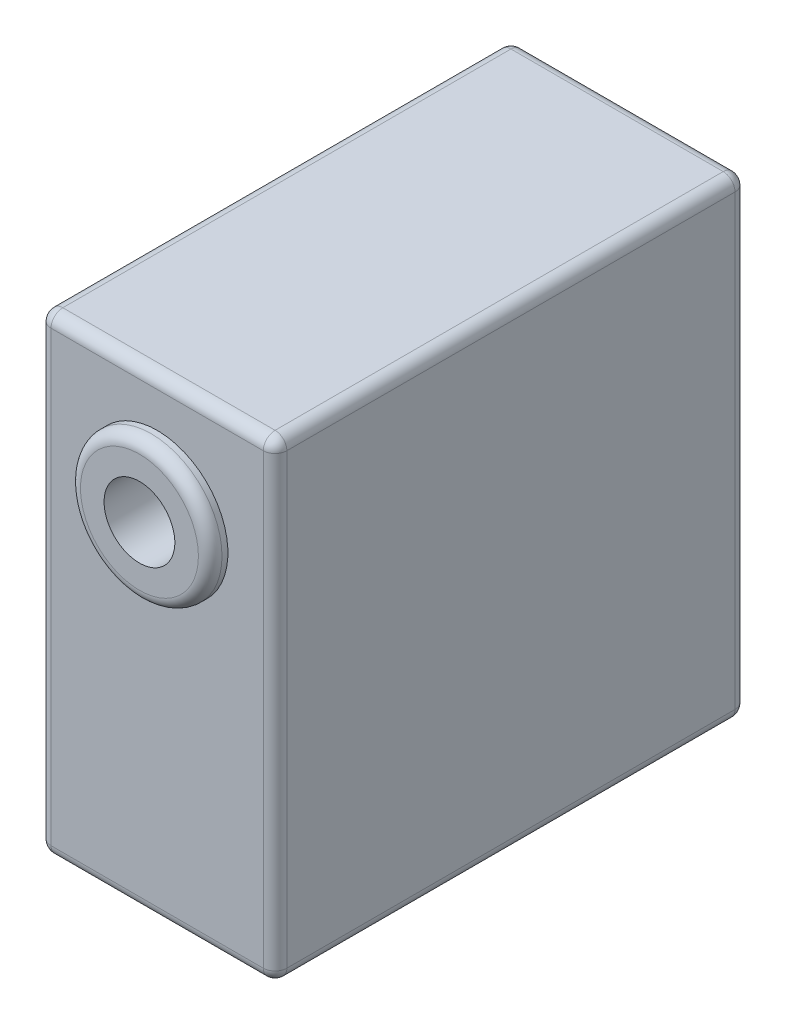
ISO-10303-21;
HEADER;
FILE_DESCRIPTION(('STEP AP214'),'2;1');
FILE_NAME('part.step','',(''),(''),'','','');
FILE_SCHEMA(('AUTOMOTIVE_DESIGN { 1 0 10303 214 1 1 1 1 }'));
ENDSEC;
DATA;
#1=APPLICATION_CONTEXT('core data for automotive mechanical design processes');
#2=APPLICATION_PROTOCOL_DEFINITION('international standard','automotive_design',2000,#1);
#3=PRODUCT_CONTEXT('',#1,'mechanical');
#4=PRODUCT('Part','Part','',(#3));
#5=PRODUCT_RELATED_PRODUCT_CATEGORY('part','',(#4));
#6=PRODUCT_DEFINITION_FORMATION('','',#4);
#7=PRODUCT_DEFINITION_CONTEXT('part definition',#1,'design');
#8=PRODUCT_DEFINITION('design','',#6,#7);
#9=PRODUCT_DEFINITION_SHAPE('','',#8);
#10=(LENGTH_UNIT() NAMED_UNIT(*) SI_UNIT(.MILLI.,.METRE.));
#11=(NAMED_UNIT(*) PLANE_ANGLE_UNIT() SI_UNIT($,.RADIAN.));
#12=(NAMED_UNIT(*) SI_UNIT($,.STERADIAN.) SOLID_ANGLE_UNIT());
#13=UNCERTAINTY_MEASURE_WITH_UNIT(LENGTH_MEASURE(1.E-05),#10,'distance_accuracy_value','');
#14=(GEOMETRIC_REPRESENTATION_CONTEXT(3) GLOBAL_UNCERTAINTY_ASSIGNED_CONTEXT((#13)) GLOBAL_UNIT_ASSIGNED_CONTEXT((#10,
#11,#12)) REPRESENTATION_CONTEXT('',''));
#15=CARTESIAN_POINT('',(0.,0.,0.));
#16=DIRECTION('',(0.,0.,1.));
#17=DIRECTION('',(1.,0.,0.));
#18=AXIS2_PLACEMENT_3D('',#15,#16,#17);
#19=CARTESIAN_POINT('',(20.,-27.1272727272727,13.3818181818182));
#20=DIRECTION('',(0.,0.,-1.));
#21=DIRECTION('',(-1.,0.,0.));
#22=AXIS2_PLACEMENT_3D('',#19,#20,#21);
#23=PLANE('',#22);
#24=CARTESIAN_POINT('',(10.,2.87272727272728,13.3818181818182));
#25=DIRECTION('',(0.,0.,-1.));
#26=DIRECTION('',(-1.,0.,0.));
#27=AXIS2_PLACEMENT_3D('',#24,#25,#26);
#28=CIRCLE('',#27,6.);
#29=CARTESIAN_POINT('',(4.,2.87272727272728,13.3818181818182));
#30=VERTEX_POINT('',#29);
#31=EDGE_CURVE('E215',#30,#30,#28,.F.);
#32=ORIENTED_EDGE('',*,*,#31,.F.);
#33=EDGE_LOOP('',(#32));
#34=FACE_BOUND('',#33,.T.);
#35=DIRECTION('',(0.,-1.,0.));
#36=VECTOR('',#35,1.);
#37=CARTESIAN_POINT('',(1.,-27.1272727272727,13.3818181818182));
#38=LINE('',#37,#36);
#39=CARTESIAN_POINT('',(1.,11.8727272727273,13.3818181818182));
#40=VERTEX_POINT('',#39);
#41=CARTESIAN_POINT('',(1.,-26.1272727272727,13.3818181818182));
#42=VERTEX_POINT('',#41);
#43=EDGE_CURVE('E194',#40,#42,#38,.T.);
#44=ORIENTED_EDGE('',*,*,#43,.T.);
#45=DIRECTION('',(-1.,0.,0.));
#46=VECTOR('',#45,1.);
#47=CARTESIAN_POINT('',(20.,-26.1272727272727,13.3818181818182));
#48=LINE('',#47,#46);
#49=CARTESIAN_POINT('',(19.,-26.1272727272727,13.3818181818182));
#50=VERTEX_POINT('',#49);
#51=EDGE_CURVE('E198',#42,#50,#48,.F.);
#52=ORIENTED_EDGE('',*,*,#51,.T.);
#53=DIRECTION('',(0.,-1.,0.));
#54=VECTOR('',#53,1.);
#55=CARTESIAN_POINT('',(19.,-27.1272727272727,13.3818181818182));
#56=LINE('',#55,#54);
#57=CARTESIAN_POINT('',(19.,11.8727272727273,13.3818181818182));
#58=VERTEX_POINT('',#57);
#59=EDGE_CURVE('E196',#50,#58,#56,.F.);
#60=ORIENTED_EDGE('',*,*,#59,.T.);
#61=DIRECTION('',(-1.,0.,0.));
#62=VECTOR('',#61,1.);
#63=CARTESIAN_POINT('',(20.,11.8727272727273,13.3818181818182));
#64=LINE('',#63,#62);
#65=EDGE_CURVE('E192',#58,#40,#64,.T.);
#66=ORIENTED_EDGE('',*,*,#65,.T.);
#67=EDGE_LOOP('',(#44,#52,#60,#66));
#68=FACE_BOUND('',#67,.T.);
#69=ADVANCED_FACE('F44',(#34,#68),#23,.F.);
#70=CARTESIAN_POINT('',(20.,-27.1272727272727,-26.6181818181818));
#71=DIRECTION('',(0.,1.,0.));
#72=DIRECTION('',(0.,0.,1.));
#73=AXIS2_PLACEMENT_3D('',#70,#71,#72);
#74=PLANE('',#73);
#75=DIRECTION('',(0.,0.,-1.));
#76=VECTOR('',#75,1.);
#77=CARTESIAN_POINT('',(1.,-27.1272727272727,-26.6181818181818));
#78=LINE('',#77,#76);
#79=CARTESIAN_POINT('',(1.,-27.1272727272727,12.3818181818182));
#80=VERTEX_POINT('',#79);
#81=CARTESIAN_POINT('',(1.,-27.1272727272727,-25.6181818181818));
#82=VERTEX_POINT('',#81);
#83=EDGE_CURVE('E187',#80,#82,#78,.T.);
#84=ORIENTED_EDGE('',*,*,#83,.T.);
#85=DIRECTION('',(-1.,0.,0.));
#86=VECTOR('',#85,1.);
#87=CARTESIAN_POINT('',(20.,-27.1272727272727,-25.6181818181818));
#88=LINE('',#87,#86);
#89=CARTESIAN_POINT('',(19.,-27.1272727272727,-25.6181818181818));
#90=VERTEX_POINT('',#89);
#91=EDGE_CURVE('E189',#82,#90,#88,.F.);
#92=ORIENTED_EDGE('',*,*,#91,.T.);
#93=DIRECTION('',(0.,0.,-1.));
#94=VECTOR('',#93,1.);
#95=CARTESIAN_POINT('',(19.,-27.1272727272727,-26.6181818181818));
#96=LINE('',#95,#94);
#97=CARTESIAN_POINT('',(19.,-27.1272727272727,12.3818181818182));
#98=VERTEX_POINT('',#97);
#99=EDGE_CURVE('E183',#90,#98,#96,.F.);
#100=ORIENTED_EDGE('',*,*,#99,.T.);
#101=DIRECTION('',(-1.,0.,0.));
#102=VECTOR('',#101,1.);
#103=CARTESIAN_POINT('',(20.,-27.1272727272727,12.3818181818182));
#104=LINE('',#103,#102);
#105=EDGE_CURVE('E185',#98,#80,#104,.T.);
#106=ORIENTED_EDGE('',*,*,#105,.T.);
#107=EDGE_LOOP('',(#84,#92,#100,#106));
#108=FACE_BOUND('',#107,.T.);
#109=ADVANCED_FACE('F285',(#108),#74,.F.);
#110=CARTESIAN_POINT('',(20.,12.8727272727273,-26.6181818181818));
#111=DIRECTION('',(0.,0.,1.));
#112=DIRECTION('',(1.,0.,0.));
#113=AXIS2_PLACEMENT_3D('',#110,#111,#112);
#114=PLANE('',#113);
#115=CARTESIAN_POINT('',(10.,2.87272727272728,-26.6181818181818));
#116=DIRECTION('',(0.,0.,1.));
#117=DIRECTION('',(1.,0.,0.));
#118=AXIS2_PLACEMENT_3D('',#115,#116,#117);
#119=CIRCLE('',#118,6.);
#120=CARTESIAN_POINT('',(16.,2.87272727272728,-26.6181818181818));
#121=VERTEX_POINT('',#120);
#122=EDGE_CURVE('E52',#121,#121,#119,.F.);
#123=ORIENTED_EDGE('',*,*,#122,.F.);
#124=EDGE_LOOP('',(#123));
#125=FACE_BOUND('',#124,.T.);
#126=DIRECTION('',(-1.,0.,0.));
#127=VECTOR('',#126,1.);
#128=CARTESIAN_POINT('',(20.,-26.1272727272727,-26.6181818181818));
#129=LINE('',#128,#127);
#130=CARTESIAN_POINT('',(19.,-26.1272727272727,-26.6181818181818));
#131=VERTEX_POINT('',#130);
#132=CARTESIAN_POINT('',(1.,-26.1272727272727,-26.6181818181818));
#133=VERTEX_POINT('',#132);
#134=EDGE_CURVE('E170',#131,#133,#129,.T.);
#135=ORIENTED_EDGE('',*,*,#134,.T.);
#136=DIRECTION('',(0.,1.,0.));
#137=VECTOR('',#136,1.);
#138=CARTESIAN_POINT('',(1.,12.8727272727273,-26.6181818181818));
#139=LINE('',#138,#137);
#140=CARTESIAN_POINT('',(1.,11.8727272727273,-26.6181818181818));
#141=VERTEX_POINT('',#140);
#142=EDGE_CURVE('E140',#133,#141,#139,.T.);
#143=ORIENTED_EDGE('',*,*,#142,.T.);
#144=DIRECTION('',(-1.,0.,0.));
#145=VECTOR('',#144,1.);
#146=CARTESIAN_POINT('',(20.,11.8727272727273,-26.6181818181818));
#147=LINE('',#146,#145);
#148=CARTESIAN_POINT('',(19.,11.8727272727273,-26.6181818181818));
#149=VERTEX_POINT('',#148);
#150=EDGE_CURVE('E159',#141,#149,#147,.F.);
#151=ORIENTED_EDGE('',*,*,#150,.T.);
#152=DIRECTION('',(0.,1.,0.));
#153=VECTOR('',#152,1.);
#154=CARTESIAN_POINT('',(19.,12.8727272727273,-26.6181818181818));
#155=LINE('',#154,#153);
#156=EDGE_CURVE('E165',#149,#131,#155,.F.);
#157=ORIENTED_EDGE('',*,*,#156,.T.);
#158=EDGE_LOOP('',(#135,#143,#151,#157));
#159=FACE_BOUND('',#158,.T.);
#160=ADVANCED_FACE('F168',(#125,#159),#114,.F.);
#161=CARTESIAN_POINT('',(20.,12.8727272727273,13.3818181818182));
#162=DIRECTION('',(0.,-1.,0.));
#163=DIRECTION('',(0.,0.,-1.));
#164=AXIS2_PLACEMENT_3D('',#161,#162,#163);
#165=PLANE('',#164);
#166=DIRECTION('',(0.,0.,1.));
#167=VECTOR('',#166,1.);
#168=CARTESIAN_POINT('',(1.,12.8727272727273,13.3818181818182));
#169=LINE('',#168,#167);
#170=CARTESIAN_POINT('',(1.,12.8727272727273,-25.6181818181818));
#171=VERTEX_POINT('',#170);
#172=CARTESIAN_POINT('',(1.,12.8727272727273,12.3818181818182));
#173=VERTEX_POINT('',#172);
#174=EDGE_CURVE('E59',#171,#173,#169,.T.);
#175=ORIENTED_EDGE('',*,*,#174,.T.);
#176=DIRECTION('',(-1.,0.,0.));
#177=VECTOR('',#176,1.);
#178=CARTESIAN_POINT('',(20.,12.8727272727273,12.3818181818182));
#179=LINE('',#178,#177);
#180=CARTESIAN_POINT('',(19.,12.8727272727273,12.3818181818182));
#181=VERTEX_POINT('',#180);
#182=EDGE_CURVE('E214',#173,#181,#179,.F.);
#183=ORIENTED_EDGE('',*,*,#182,.T.);
#184=DIRECTION('',(0.,0.,1.));
#185=VECTOR('',#184,1.);
#186=CARTESIAN_POINT('',(19.,12.8727272727273,13.3818181818182));
#187=LINE('',#186,#185);
#188=CARTESIAN_POINT('',(19.,12.8727272727273,-25.6181818181818));
#189=VERTEX_POINT('',#188);
#190=EDGE_CURVE('E67',#181,#189,#187,.F.);
#191=ORIENTED_EDGE('',*,*,#190,.T.);
#192=DIRECTION('',(-1.,0.,0.));
#193=VECTOR('',#192,1.);
#194=CARTESIAN_POINT('',(20.,12.8727272727273,-25.6181818181818));
#195=LINE('',#194,#193);
#196=EDGE_CURVE('E210',#189,#171,#195,.T.);
#197=ORIENTED_EDGE('',*,*,#196,.T.);
#198=EDGE_LOOP('',(#175,#183,#191,#197));
#199=FACE_BOUND('',#198,.T.);
#200=ADVANCED_FACE('F284',(#199),#165,.F.);
#201=CARTESIAN_POINT('',(20.,0.,0.));
#202=DIRECTION('',(-1.,0.,0.));
#203=DIRECTION('',(0.,0.,1.));
#204=AXIS2_PLACEMENT_3D('',#201,#202,#203);
#205=PLANE('',#204);
#206=DIRECTION('',(0.,-1.,0.));
#207=VECTOR('',#206,1.);
#208=CARTESIAN_POINT('',(20.,0.,12.3818181818182));
#209=LINE('',#208,#207);
#210=CARTESIAN_POINT('',(20.,11.8727272727273,12.3818181818182));
#211=VERTEX_POINT('',#210);
#212=CARTESIAN_POINT('',(20.,-26.1272727272727,12.3818181818182));
#213=VERTEX_POINT('',#212);
#214=EDGE_CURVE('E203',#211,#213,#209,.T.);
#215=ORIENTED_EDGE('',*,*,#214,.T.);
#216=DIRECTION('',(0.,0.,-1.));
#217=VECTOR('',#216,1.);
#218=CARTESIAN_POINT('',(20.,-26.1272727272727,0.));
#219=LINE('',#218,#217);
#220=CARTESIAN_POINT('',(20.,-26.1272727272727,-25.6181818181818));
#221=VERTEX_POINT('',#220);
#222=EDGE_CURVE('E207',#213,#221,#219,.T.);
#223=ORIENTED_EDGE('',*,*,#222,.T.);
#224=DIRECTION('',(0.,1.,0.));
#225=VECTOR('',#224,1.);
#226=CARTESIAN_POINT('',(20.,0.,-25.6181818181818));
#227=LINE('',#226,#225);
#228=CARTESIAN_POINT('',(20.,11.8727272727273,-25.6181818181818));
#229=VERTEX_POINT('',#228);
#230=EDGE_CURVE('E205',#221,#229,#227,.T.);
#231=ORIENTED_EDGE('',*,*,#230,.T.);
#232=DIRECTION('',(0.,0.,1.));
#233=VECTOR('',#232,1.);
#234=CARTESIAN_POINT('',(20.,11.8727272727273,0.));
#235=LINE('',#234,#233);
#236=EDGE_CURVE('E201',#229,#211,#235,.T.);
#237=ORIENTED_EDGE('',*,*,#236,.T.);
#238=EDGE_LOOP('',(#215,#223,#231,#237));
#239=FACE_BOUND('',#238,.T.);
#240=ADVANCED_FACE('F291',(#239),#205,.F.);
#241=CARTESIAN_POINT('',(0.,0.,0.));
#242=DIRECTION('',(-1.,0.,0.));
#243=DIRECTION('',(0.,0.,1.));
#244=AXIS2_PLACEMENT_3D('',#241,#242,#243);
#245=PLANE('',#244);
#246=DIRECTION('',(0.,0.,1.));
#247=VECTOR('',#246,1.);
#248=CARTESIAN_POINT('',(0.,11.8727272727273,-26.6181818181818));
#249=LINE('',#248,#247);
#250=CARTESIAN_POINT('',(0.,11.8727272727273,12.3818181818182));
#251=VERTEX_POINT('',#250);
#252=CARTESIAN_POINT('',(0.,11.8727272727273,-25.6181818181818));
#253=VERTEX_POINT('',#252);
#254=EDGE_CURVE('E172',#251,#253,#249,.F.);
#255=ORIENTED_EDGE('',*,*,#254,.T.);
#256=DIRECTION('',(0.,1.,0.));
#257=VECTOR('',#256,1.);
#258=CARTESIAN_POINT('',(0.,-27.1272727272727,-25.6181818181818));
#259=LINE('',#258,#257);
#260=CARTESIAN_POINT('',(0.,-26.1272727272727,-25.6181818181818));
#261=VERTEX_POINT('',#260);
#262=EDGE_CURVE('E142',#253,#261,#259,.F.);
#263=ORIENTED_EDGE('',*,*,#262,.T.);
#264=DIRECTION('',(0.,0.,-1.));
#265=VECTOR('',#264,1.);
#266=CARTESIAN_POINT('',(0.,-26.1272727272727,13.3818181818182));
#267=LINE('',#266,#265);
#268=CARTESIAN_POINT('',(0.,-26.1272727272727,12.3818181818182));
#269=VERTEX_POINT('',#268);
#270=EDGE_CURVE('E180',#261,#269,#267,.F.);
#271=ORIENTED_EDGE('',*,*,#270,.T.);
#272=DIRECTION('',(0.,-1.,0.));
#273=VECTOR('',#272,1.);
#274=CARTESIAN_POINT('',(0.,12.8727272727273,12.3818181818182));
#275=LINE('',#274,#273);
#276=EDGE_CURVE('E174',#269,#251,#275,.F.);
#277=ORIENTED_EDGE('',*,*,#276,.T.);
#278=EDGE_LOOP('',(#255,#263,#271,#277));
#279=FACE_BOUND('',#278,.T.);
#280=ADVANCED_FACE('F375',(#279),#245,.T.);
#281=CARTESIAN_POINT('',(19.,0.,12.3818181818182));
#282=DIRECTION('',(0.,-1.,0.));
#283=DIRECTION('',(0.,0.,-1.));
#284=AXIS2_PLACEMENT_3D('',#281,#282,#283);
#285=CYLINDRICAL_SURFACE('',#284,1.);
#286=CARTESIAN_POINT('',(19.,-26.1272727272727,12.3818181818182));
#287=DIRECTION('',(0.,-1.,0.));
#288=DIRECTION('',(0.,0.,-1.));
#289=AXIS2_PLACEMENT_3D('',#286,#287,#288);
#290=CIRCLE('',#289,1.);
#291=EDGE_CURVE('E166',#213,#50,#290,.T.);
#292=ORIENTED_EDGE('',*,*,#291,.F.);
#293=ORIENTED_EDGE('',*,*,#214,.F.);
#294=CARTESIAN_POINT('',(19.,11.8727272727273,12.3818181818182));
#295=DIRECTION('',(0.,1.,0.));
#296=DIRECTION('',(0.,0.,1.));
#297=AXIS2_PLACEMENT_3D('',#294,#295,#296);
#298=CIRCLE('',#297,1.);
#299=EDGE_CURVE('E266',#58,#211,#298,.T.);
#300=ORIENTED_EDGE('',*,*,#299,.F.);
#301=ORIENTED_EDGE('',*,*,#59,.F.);
#302=EDGE_LOOP('',(#292,#293,#300,#301));
#303=FACE_BOUND('',#302,.T.);
#304=ADVANCED_FACE('F372',(#303),#285,.T.);
#305=CARTESIAN_POINT('',(19.,-26.1272727272727,12.3818181818182));
#306=DIRECTION('',(0.,0.,1.));
#307=DIRECTION('',(1.,0.,0.));
#308=AXIS2_PLACEMENT_3D('',#305,#306,#307);
#309=SPHERICAL_SURFACE('',#308,1.);
#310=CARTESIAN_POINT('',(19.,-26.1272727272727,12.3818181818182));
#311=DIRECTION('',(0.,0.,1.));
#312=DIRECTION('',(1.,0.,0.));
#313=AXIS2_PLACEMENT_3D('',#310,#311,#312);
#314=CIRCLE('',#313,1.);
#315=EDGE_CURVE('E261',#213,#98,#314,.F.);
#316=ORIENTED_EDGE('',*,*,#315,.F.);
#317=ORIENTED_EDGE('',*,*,#291,.T.);
#318=CARTESIAN_POINT('',(19.,-26.1272727272727,12.3818181818182));
#319=DIRECTION('',(1.,0.,0.));
#320=DIRECTION('',(0.,0.,-1.));
#321=AXIS2_PLACEMENT_3D('',#318,#319,#320);
#322=CIRCLE('',#321,1.);
#323=EDGE_CURVE('E264',#98,#50,#322,.F.);
#324=ORIENTED_EDGE('',*,*,#323,.F.);
#325=EDGE_LOOP('',(#316,#317,#324));
#326=FACE_BOUND('',#325,.T.);
#327=ADVANCED_FACE('F368',(#326),#309,.T.);
#328=CARTESIAN_POINT('',(19.,11.8727272727273,12.3818181818182));
#329=DIRECTION('',(0.,0.,1.));
#330=DIRECTION('',(1.,0.,0.));
#331=AXIS2_PLACEMENT_3D('',#328,#329,#330);
#332=SPHERICAL_SURFACE('',#331,1.);
#333=CARTESIAN_POINT('',(19.,11.8727272727273,12.3818181818182));
#334=DIRECTION('',(1.,0.,0.));
#335=DIRECTION('',(0.,0.,-1.));
#336=AXIS2_PLACEMENT_3D('',#333,#334,#335);
#337=CIRCLE('',#336,1.);
#338=EDGE_CURVE('E256',#58,#181,#337,.F.);
#339=ORIENTED_EDGE('',*,*,#338,.F.);
#340=ORIENTED_EDGE('',*,*,#299,.T.);
#341=CARTESIAN_POINT('',(19.,11.8727272727273,12.3818181818182));
#342=DIRECTION('',(0.,0.,1.));
#343=DIRECTION('',(1.,0.,0.));
#344=AXIS2_PLACEMENT_3D('',#341,#342,#343);
#345=CIRCLE('',#344,1.);
#346=EDGE_CURVE('E259',#181,#211,#345,.F.);
#347=ORIENTED_EDGE('',*,*,#346,.F.);
#348=EDGE_LOOP('',(#339,#340,#347));
#349=FACE_BOUND('',#348,.T.);
#350=ADVANCED_FACE('F364',(#349),#332,.T.);
#351=CARTESIAN_POINT('',(20.,-26.1272727272727,12.3818181818182));
#352=DIRECTION('',(-1.,0.,0.));
#353=DIRECTION('',(0.,0.,1.));
#354=AXIS2_PLACEMENT_3D('',#351,#352,#353);
#355=CYLINDRICAL_SURFACE('',#354,1.);
#356=ORIENTED_EDGE('',*,*,#323,.T.);
#357=ORIENTED_EDGE('',*,*,#51,.F.);
#358=CARTESIAN_POINT('',(1.,-26.1272727272727,12.3818181818182));
#359=DIRECTION('',(-1.,0.,0.));
#360=DIRECTION('',(0.,0.,1.));
#361=AXIS2_PLACEMENT_3D('',#358,#359,#360);
#362=CIRCLE('',#361,1.);
#363=EDGE_CURVE('E250',#80,#42,#362,.T.);
#364=ORIENTED_EDGE('',*,*,#363,.F.);
#365=ORIENTED_EDGE('',*,*,#105,.F.);
#366=EDGE_LOOP('',(#356,#357,#364,#365));
#367=FACE_BOUND('',#366,.T.);
#368=ADVANCED_FACE('F360',(#367),#355,.T.);
#369=CARTESIAN_POINT('',(19.,-26.1272727272727,0.));
#370=DIRECTION('',(0.,0.,-1.));
#371=DIRECTION('',(0.,1.,0.));
#372=AXIS2_PLACEMENT_3D('',#369,#370,#371);
#373=CYLINDRICAL_SURFACE('',#372,1.);
#374=ORIENTED_EDGE('',*,*,#315,.T.);
#375=ORIENTED_EDGE('',*,*,#99,.F.);
#376=CARTESIAN_POINT('',(19.,-26.1272727272727,-25.6181818181818));
#377=DIRECTION('',(0.,0.,-1.));
#378=DIRECTION('',(-1.,0.,0.));
#379=AXIS2_PLACEMENT_3D('',#376,#377,#378);
#380=CIRCLE('',#379,1.);
#381=EDGE_CURVE('E247',#221,#90,#380,.T.);
#382=ORIENTED_EDGE('',*,*,#381,.F.);
#383=ORIENTED_EDGE('',*,*,#222,.F.);
#384=EDGE_LOOP('',(#374,#375,#382,#383));
#385=FACE_BOUND('',#384,.T.);
#386=ADVANCED_FACE('F356',(#385),#373,.T.);
#387=CARTESIAN_POINT('',(19.,0.,-25.6181818181818));
#388=DIRECTION('',(0.,1.,0.));
#389=DIRECTION('',(0.,0.,1.));
#390=AXIS2_PLACEMENT_3D('',#387,#388,#389);
#391=CYLINDRICAL_SURFACE('',#390,1.);
#392=CARTESIAN_POINT('',(19.,11.8727272727273,-25.6181818181818));
#393=DIRECTION('',(0.,1.,0.));
#394=DIRECTION('',(0.,0.,1.));
#395=AXIS2_PLACEMENT_3D('',#392,#393,#394);
#396=CIRCLE('',#395,1.);
#397=EDGE_CURVE('E242',#229,#149,#396,.T.);
#398=ORIENTED_EDGE('',*,*,#397,.F.);
#399=ORIENTED_EDGE('',*,*,#230,.F.);
#400=CARTESIAN_POINT('',(19.,-26.1272727272727,-25.6181818181818));
#401=DIRECTION('',(0.,-1.,0.));
#402=DIRECTION('',(1.,0.,0.));
#403=AXIS2_PLACEMENT_3D('',#400,#401,#402);
#404=CIRCLE('',#403,1.);
#405=EDGE_CURVE('E245',#131,#221,#404,.T.);
#406=ORIENTED_EDGE('',*,*,#405,.F.);
#407=ORIENTED_EDGE('',*,*,#156,.F.);
#408=EDGE_LOOP('',(#398,#399,#406,#407));
#409=FACE_BOUND('',#408,.T.);
#410=ADVANCED_FACE('F353',(#409),#391,.T.);
#411=CARTESIAN_POINT('',(19.,11.8727272727273,0.));
#412=DIRECTION('',(0.,0.,1.));
#413=DIRECTION('',(1.,0.,0.));
#414=AXIS2_PLACEMENT_3D('',#411,#412,#413);
#415=CYLINDRICAL_SURFACE('',#414,1.);
#416=ORIENTED_EDGE('',*,*,#346,.T.);
#417=ORIENTED_EDGE('',*,*,#236,.F.);
#418=CARTESIAN_POINT('',(19.,11.8727272727273,-25.6181818181818));
#419=DIRECTION('',(0.,0.,-1.));
#420=DIRECTION('',(-1.,0.,0.));
#421=AXIS2_PLACEMENT_3D('',#418,#419,#420);
#422=CIRCLE('',#421,1.);
#423=EDGE_CURVE('E239',#189,#229,#422,.T.);
#424=ORIENTED_EDGE('',*,*,#423,.F.);
#425=ORIENTED_EDGE('',*,*,#190,.F.);
#426=EDGE_LOOP('',(#416,#417,#424,#425));
#427=FACE_BOUND('',#426,.T.);
#428=ADVANCED_FACE('F349',(#427),#415,.T.);
#429=CARTESIAN_POINT('',(20.,11.8727272727273,12.3818181818182));
#430=DIRECTION('',(-1.,0.,0.));
#431=DIRECTION('',(0.,0.,1.));
#432=AXIS2_PLACEMENT_3D('',#429,#430,#431);
#433=CYLINDRICAL_SURFACE('',#432,1.);
#434=ORIENTED_EDGE('',*,*,#338,.T.);
#435=ORIENTED_EDGE('',*,*,#182,.F.);
#436=CARTESIAN_POINT('',(1.,11.8727272727273,12.3818181818182));
#437=DIRECTION('',(-1.,0.,0.));
#438=DIRECTION('',(0.,0.,1.));
#439=AXIS2_PLACEMENT_3D('',#436,#437,#438);
#440=CIRCLE('',#439,1.);
#441=EDGE_CURVE('E236',#40,#173,#440,.T.);
#442=ORIENTED_EDGE('',*,*,#441,.F.);
#443=ORIENTED_EDGE('',*,*,#65,.F.);
#444=EDGE_LOOP('',(#434,#435,#442,#443));
#445=FACE_BOUND('',#444,.T.);
#446=ADVANCED_FACE('F345',(#445),#433,.T.);
#447=CARTESIAN_POINT('',(1.,-27.1272727272727,12.3818181818182));
#448=DIRECTION('',(0.,1.,0.));
#449=DIRECTION('',(0.,0.,1.));
#450=AXIS2_PLACEMENT_3D('',#447,#448,#449);
#451=CYLINDRICAL_SURFACE('',#450,1.);
#452=CARTESIAN_POINT('',(1.,-26.1272727272727,12.3818181818182));
#453=DIRECTION('',(0.,-1.,0.));
#454=DIRECTION('',(0.,0.,-1.));
#455=AXIS2_PLACEMENT_3D('',#452,#453,#454);
#456=CIRCLE('',#455,1.);
#457=EDGE_CURVE('E253',#42,#269,#456,.T.);
#458=ORIENTED_EDGE('',*,*,#457,.F.);
#459=ORIENTED_EDGE('',*,*,#43,.F.);
#460=CARTESIAN_POINT('',(1.,11.8727272727273,12.3818181818182));
#461=DIRECTION('',(0.,1.,0.));
#462=DIRECTION('',(0.,0.,1.));
#463=AXIS2_PLACEMENT_3D('',#460,#461,#462);
#464=CIRCLE('',#463,1.);
#465=EDGE_CURVE('E233',#251,#40,#464,.T.);
#466=ORIENTED_EDGE('',*,*,#465,.F.);
#467=ORIENTED_EDGE('',*,*,#276,.F.);
#468=EDGE_LOOP('',(#458,#459,#466,#467));
#469=FACE_BOUND('',#468,.T.);
#470=ADVANCED_FACE('F341',(#469),#451,.T.);
#471=CARTESIAN_POINT('',(1.,-26.1272727272727,12.3818181818182));
#472=DIRECTION('',(0.,0.,1.));
#473=DIRECTION('',(1.,0.,0.));
#474=AXIS2_PLACEMENT_3D('',#471,#472,#473);
#475=SPHERICAL_SURFACE('',#474,1.);
#476=ORIENTED_EDGE('',*,*,#363,.T.);
#477=ORIENTED_EDGE('',*,*,#457,.T.);
#478=CARTESIAN_POINT('',(1.,-26.1272727272727,12.3818181818182));
#479=DIRECTION('',(0.,0.,1.));
#480=DIRECTION('',(0.,-1.,0.));
#481=AXIS2_PLACEMENT_3D('',#478,#479,#480);
#482=CIRCLE('',#481,1.);
#483=EDGE_CURVE('E230',#80,#269,#482,.F.);
#484=ORIENTED_EDGE('',*,*,#483,.F.);
#485=EDGE_LOOP('',(#476,#477,#484));
#486=FACE_BOUND('',#485,.T.);
#487=ADVANCED_FACE('F337',(#486),#475,.T.);
#488=CARTESIAN_POINT('',(19.,-26.1272727272727,-25.6181818181818));
#489=DIRECTION('',(0.,0.,1.));
#490=DIRECTION('',(1.,0.,0.));
#491=AXIS2_PLACEMENT_3D('',#488,#489,#490);
#492=SPHERICAL_SURFACE('',#491,1.);
#493=ORIENTED_EDGE('',*,*,#405,.T.);
#494=ORIENTED_EDGE('',*,*,#381,.T.);
#495=CARTESIAN_POINT('',(19.,-26.1272727272727,-25.6181818181818));
#496=DIRECTION('',(1.,0.,0.));
#497=DIRECTION('',(0.,0.,-1.));
#498=AXIS2_PLACEMENT_3D('',#495,#496,#497);
#499=CIRCLE('',#498,1.);
#500=EDGE_CURVE('E228',#131,#90,#499,.F.);
#501=ORIENTED_EDGE('',*,*,#500,.F.);
#502=EDGE_LOOP('',(#493,#494,#501));
#503=FACE_BOUND('',#502,.T.);
#504=ADVANCED_FACE('F333',(#503),#492,.T.);
#505=CARTESIAN_POINT('',(19.,11.8727272727273,-25.6181818181818));
#506=DIRECTION('',(0.,0.,1.));
#507=DIRECTION('',(1.,0.,0.));
#508=AXIS2_PLACEMENT_3D('',#505,#506,#507);
#509=SPHERICAL_SURFACE('',#508,1.);
#510=ORIENTED_EDGE('',*,*,#423,.T.);
#511=ORIENTED_EDGE('',*,*,#397,.T.);
#512=CARTESIAN_POINT('',(19.,11.8727272727273,-25.6181818181818));
#513=DIRECTION('',(1.,0.,0.));
#514=DIRECTION('',(0.,0.,-1.));
#515=AXIS2_PLACEMENT_3D('',#512,#513,#514);
#516=CIRCLE('',#515,1.);
#517=EDGE_CURVE('E162',#189,#149,#516,.F.);
#518=ORIENTED_EDGE('',*,*,#517,.F.);
#519=EDGE_LOOP('',(#510,#511,#518));
#520=FACE_BOUND('',#519,.T.);
#521=ADVANCED_FACE('F329',(#520),#509,.T.);
#522=CARTESIAN_POINT('',(1.,11.8727272727273,12.3818181818182));
#523=DIRECTION('',(0.,0.,1.));
#524=DIRECTION('',(1.,0.,0.));
#525=AXIS2_PLACEMENT_3D('',#522,#523,#524);
#526=SPHERICAL_SURFACE('',#525,1.);
#527=ORIENTED_EDGE('',*,*,#465,.T.);
#528=ORIENTED_EDGE('',*,*,#441,.T.);
#529=CARTESIAN_POINT('',(1.,11.8727272727273,12.3818181818182));
#530=DIRECTION('',(0.,0.,1.));
#531=DIRECTION('',(1.,0.,0.));
#532=AXIS2_PLACEMENT_3D('',#529,#530,#531);
#533=CIRCLE('',#532,1.);
#534=EDGE_CURVE('E224',#251,#173,#533,.F.);
#535=ORIENTED_EDGE('',*,*,#534,.F.);
#536=EDGE_LOOP('',(#527,#528,#535));
#537=FACE_BOUND('',#536,.T.);
#538=ADVANCED_FACE('F325',(#537),#526,.T.);
#539=CARTESIAN_POINT('',(1.,-26.1272727272727,-26.6181818181818));
#540=DIRECTION('',(0.,0.,1.));
#541=DIRECTION('',(0.,-1.,0.));
#542=AXIS2_PLACEMENT_3D('',#539,#540,#541);
#543=CYLINDRICAL_SURFACE('',#542,1.);
#544=ORIENTED_EDGE('',*,*,#483,.T.);
#545=ORIENTED_EDGE('',*,*,#270,.F.);
#546=CARTESIAN_POINT('',(1.,-26.1272727272727,-25.6181818181818));
#547=DIRECTION('',(0.,0.,-1.));
#548=DIRECTION('',(-1.,0.,0.));
#549=AXIS2_PLACEMENT_3D('',#546,#547,#548);
#550=CIRCLE('',#549,1.);
#551=EDGE_CURVE('E221',#82,#261,#550,.T.);
#552=ORIENTED_EDGE('',*,*,#551,.F.);
#553=ORIENTED_EDGE('',*,*,#83,.F.);
#554=EDGE_LOOP('',(#544,#545,#552,#553));
#555=FACE_BOUND('',#554,.T.);
#556=ADVANCED_FACE('F321',(#555),#543,.T.);
#557=CARTESIAN_POINT('',(20.,-26.1272727272727,-25.6181818181818));
#558=DIRECTION('',(-1.,0.,0.));
#559=DIRECTION('',(0.,0.,1.));
#560=AXIS2_PLACEMENT_3D('',#557,#558,#559);
#561=CYLINDRICAL_SURFACE('',#560,1.);
#562=ORIENTED_EDGE('',*,*,#500,.T.);
#563=ORIENTED_EDGE('',*,*,#91,.F.);
#564=CARTESIAN_POINT('',(1.,-26.1272727272727,-25.6181818181818));
#565=DIRECTION('',(-1.,0.,0.));
#566=DIRECTION('',(0.,0.,1.));
#567=AXIS2_PLACEMENT_3D('',#564,#565,#566);
#568=CIRCLE('',#567,1.);
#569=EDGE_CURVE('E156',#133,#82,#568,.T.);
#570=ORIENTED_EDGE('',*,*,#569,.F.);
#571=ORIENTED_EDGE('',*,*,#134,.F.);
#572=EDGE_LOOP('',(#562,#563,#570,#571));
#573=FACE_BOUND('',#572,.T.);
#574=ADVANCED_FACE('F318',(#573),#561,.T.);
#575=CARTESIAN_POINT('',(20.,11.8727272727273,-25.6181818181818));
#576=DIRECTION('',(-1.,0.,0.));
#577=DIRECTION('',(0.,0.,1.));
#578=AXIS2_PLACEMENT_3D('',#575,#576,#577);
#579=CYLINDRICAL_SURFACE('',#578,1.);
#580=ORIENTED_EDGE('',*,*,#517,.T.);
#581=ORIENTED_EDGE('',*,*,#150,.F.);
#582=CARTESIAN_POINT('',(1.,11.8727272727273,-25.6181818181818));
#583=DIRECTION('',(-1.,0.,0.));
#584=DIRECTION('',(0.,0.,1.));
#585=AXIS2_PLACEMENT_3D('',#582,#583,#584);
#586=CIRCLE('',#585,1.);
#587=EDGE_CURVE('E149',#171,#141,#586,.T.);
#588=ORIENTED_EDGE('',*,*,#587,.F.);
#589=ORIENTED_EDGE('',*,*,#196,.F.);
#590=EDGE_LOOP('',(#580,#581,#588,#589));
#591=FACE_BOUND('',#590,.T.);
#592=ADVANCED_FACE('F160',(#591),#579,.T.);
#593=CARTESIAN_POINT('',(1.,11.8727272727273,13.3818181818182));
#594=DIRECTION('',(0.,0.,-1.));
#595=DIRECTION('',(-1.,0.,0.));
#596=AXIS2_PLACEMENT_3D('',#593,#594,#595);
#597=CYLINDRICAL_SURFACE('',#596,1.);
#598=ORIENTED_EDGE('',*,*,#534,.T.);
#599=ORIENTED_EDGE('',*,*,#174,.F.);
#600=CARTESIAN_POINT('',(1.,11.8727272727273,-25.6181818181818));
#601=DIRECTION('',(0.,0.,-1.));
#602=DIRECTION('',(0.,1.,0.));
#603=AXIS2_PLACEMENT_3D('',#600,#601,#602);
#604=CIRCLE('',#603,1.);
#605=EDGE_CURVE('E153',#253,#171,#604,.T.);
#606=ORIENTED_EDGE('',*,*,#605,.F.);
#607=ORIENTED_EDGE('',*,*,#254,.F.);
#608=EDGE_LOOP('',(#598,#599,#606,#607));
#609=FACE_BOUND('',#608,.T.);
#610=ADVANCED_FACE('F311',(#609),#597,.T.);
#611=CARTESIAN_POINT('',(1.,-26.1272727272727,-25.6181818181818));
#612=DIRECTION('',(0.,0.,1.));
#613=DIRECTION('',(1.,0.,0.));
#614=AXIS2_PLACEMENT_3D('',#611,#612,#613);
#615=SPHERICAL_SURFACE('',#614,1.);
#616=ORIENTED_EDGE('',*,*,#569,.T.);
#617=ORIENTED_EDGE('',*,*,#551,.T.);
#618=CARTESIAN_POINT('',(1.,-26.1272727272727,-25.6181818181818));
#619=DIRECTION('',(0.,-1.,0.));
#620=DIRECTION('',(0.,0.,-1.));
#621=AXIS2_PLACEMENT_3D('',#618,#619,#620);
#622=CIRCLE('',#621,1.);
#623=EDGE_CURVE('E145',#133,#261,#622,.F.);
#624=ORIENTED_EDGE('',*,*,#623,.F.);
#625=EDGE_LOOP('',(#616,#617,#624));
#626=FACE_BOUND('',#625,.T.);
#627=ADVANCED_FACE('F308',(#626),#615,.T.);
#628=CARTESIAN_POINT('',(1.,11.8727272727273,-25.6181818181818));
#629=DIRECTION('',(0.,0.,1.));
#630=DIRECTION('',(1.,0.,0.));
#631=AXIS2_PLACEMENT_3D('',#628,#629,#630);
#632=SPHERICAL_SURFACE('',#631,1.);
#633=ORIENTED_EDGE('',*,*,#605,.T.);
#634=ORIENTED_EDGE('',*,*,#587,.T.);
#635=CARTESIAN_POINT('',(1.,11.8727272727273,-25.6181818181818));
#636=DIRECTION('',(0.,1.,0.));
#637=DIRECTION('',(0.,0.,1.));
#638=AXIS2_PLACEMENT_3D('',#635,#636,#637);
#639=CIRCLE('',#638,1.);
#640=EDGE_CURVE('E136',#253,#141,#639,.F.);
#641=ORIENTED_EDGE('',*,*,#640,.F.);
#642=EDGE_LOOP('',(#633,#634,#641));
#643=FACE_BOUND('',#642,.T.);
#644=ADVANCED_FACE('F151',(#643),#632,.T.);
#645=CARTESIAN_POINT('',(1.,12.8727272727273,-25.6181818181818));
#646=DIRECTION('',(0.,-1.,0.));
#647=DIRECTION('',(0.,0.,-1.));
#648=AXIS2_PLACEMENT_3D('',#645,#646,#647);
#649=CYLINDRICAL_SURFACE('',#648,1.);
#650=ORIENTED_EDGE('',*,*,#623,.T.);
#651=ORIENTED_EDGE('',*,*,#262,.F.);
#652=ORIENTED_EDGE('',*,*,#640,.T.);
#653=ORIENTED_EDGE('',*,*,#142,.F.);
#654=EDGE_LOOP('',(#650,#651,#652,#653));
#655=FACE_BOUND('',#654,.T.);
#656=ADVANCED_FACE('F138',(#655),#649,.T.);
#657=CARTESIAN_POINT('',(10.,2.87272727272728,14.8818181818182));
#658=DIRECTION('',(0.,0.,-1.));
#659=DIRECTION('',(-1.,0.,0.));
#660=AXIS2_PLACEMENT_3D('',#657,#658,#659);
#661=CYLINDRICAL_SURFACE('',#660,6.);
#662=CARTESIAN_POINT('',(10.,2.87272727272728,13.8818181818182));
#663=DIRECTION('',(0.,0.,1.));
#664=DIRECTION('',(1.,0.,0.));
#665=AXIS2_PLACEMENT_3D('',#662,#663,#664);
#666=CIRCLE('',#665,6.);
#667=CARTESIAN_POINT('',(16.,2.87272727272728,13.8818181818182));
#668=VERTEX_POINT('',#667);
#669=EDGE_CURVE('E276',#668,#668,#666,.F.);
#670=ORIENTED_EDGE('',*,*,#669,.T.);
#671=EDGE_LOOP('',(#670));
#672=FACE_BOUND('',#671,.T.);
#673=ORIENTED_EDGE('',*,*,#31,.T.);
#674=EDGE_LOOP('',(#673));
#675=FACE_BOUND('',#674,.T.);
#676=ADVANCED_FACE('F305',(#672,#675),#661,.T.);
#677=CARTESIAN_POINT('',(10.,2.87272727272728,14.8818181818182));
#678=DIRECTION('',(0.,0.,1.));
#679=DIRECTION('',(1.,0.,0.));
#680=AXIS2_PLACEMENT_3D('',#677,#678,#679);
#681=PLANE('',#680);
#682=CARTESIAN_POINT('',(10.,2.87272727272728,14.8818181818182));
#683=DIRECTION('',(0.,0.,1.));
#684=DIRECTION('',(1.,0.,0.));
#685=AXIS2_PLACEMENT_3D('',#682,#683,#684);
#686=CIRCLE('',#685,3.);
#687=CARTESIAN_POINT('',(7.,2.87272727272728,14.8818181818182));
#688=VERTEX_POINT('',#687);
#689=EDGE_CURVE('E146',#688,#688,#686,.F.);
#690=ORIENTED_EDGE('',*,*,#689,.T.);
#691=EDGE_LOOP('',(#690));
#692=FACE_BOUND('',#691,.T.);
#693=CARTESIAN_POINT('',(10.,2.87272727272728,14.8818181818182));
#694=DIRECTION('',(0.,0.,1.));
#695=DIRECTION('',(1.,0.,0.));
#696=AXIS2_PLACEMENT_3D('',#693,#694,#695);
#697=CIRCLE('',#696,5.);
#698=CARTESIAN_POINT('',(15.,2.87272727272728,14.8818181818182));
#699=VERTEX_POINT('',#698);
#700=EDGE_CURVE('E273',#699,#699,#697,.T.);
#701=ORIENTED_EDGE('',*,*,#700,.T.);
#702=EDGE_LOOP('',(#701));
#703=FACE_BOUND('',#702,.T.);
#704=ADVANCED_FACE('F380',(#692,#703),#681,.T.);
#705=CARTESIAN_POINT('',(10.,2.87272727272728,13.8818181818182));
#706=DIRECTION('',(0.,0.,1.));
#707=DIRECTION('',(1.,0.,0.));
#708=AXIS2_PLACEMENT_3D('',#705,#706,#707);
#709=TOROIDAL_SURFACE('',#708,5.,1.);
#710=ORIENTED_EDGE('',*,*,#669,.F.);
#711=EDGE_LOOP('',(#710));
#712=FACE_BOUND('',#711,.T.);
#713=ORIENTED_EDGE('',*,*,#700,.F.);
#714=EDGE_LOOP('',(#713));
#715=FACE_BOUND('',#714,.T.);
#716=ADVANCED_FACE('F377',(#712,#715),#709,.T.);
#717=CARTESIAN_POINT('',(10.,2.87272727272728,-27.5181818181818));
#718=DIRECTION('',(0.,0.,-1.));
#719=DIRECTION('',(-1.,0.,0.));
#720=AXIS2_PLACEMENT_3D('',#717,#718,#719);
#721=PLANE('',#720);
#722=CARTESIAN_POINT('',(10.,2.87272727272728,-27.5181818181818));
#723=DIRECTION('',(0.,0.,1.));
#724=DIRECTION('',(1.,0.,0.));
#725=AXIS2_PLACEMENT_3D('',#722,#723,#724);
#726=CIRCLE('',#725,3.);
#727=CARTESIAN_POINT('',(7.,2.87272727272728,-27.5181818181818));
#728=VERTEX_POINT('',#727);
#729=EDGE_CURVE('E423',#728,#728,#726,.T.);
#730=ORIENTED_EDGE('',*,*,#729,.T.);
#731=EDGE_LOOP('',(#730));
#732=FACE_BOUND('',#731,.T.);
#733=CARTESIAN_POINT('',(10.,2.87272727272728,-27.5181818181818));
#734=DIRECTION('',(0.,0.,-1.));
#735=DIRECTION('',(-1.,0.,0.));
#736=AXIS2_PLACEMENT_3D('',#733,#734,#735);
#737=CIRCLE('',#736,5.00501256289338);
#738=CARTESIAN_POINT('',(4.99498743710662,2.87272727272728,-27.5181818181818));
#739=VERTEX_POINT('',#738);
#740=EDGE_CURVE('E13',#739,#739,#737,.T.);
#741=ORIENTED_EDGE('',*,*,#740,.T.);
#742=EDGE_LOOP('',(#741));
#743=FACE_BOUND('',#742,.T.);
#744=ADVANCED_FACE('F379',(#732,#743),#721,.T.);
#745=CARTESIAN_POINT('',(10.,2.87272727272728,-26.5181818181818));
#746=DIRECTION('',(0.,0.,1.));
#747=DIRECTION('',(1.,0.,0.));
#748=AXIS2_PLACEMENT_3D('',#745,#746,#747);
#749=TOROIDAL_SURFACE('',#748,5.00501256289338,1.);
#750=ORIENTED_EDGE('',*,*,#122,.T.);
#751=EDGE_LOOP('',(#750));
#752=FACE_BOUND('',#751,.T.);
#753=ORIENTED_EDGE('',*,*,#740,.F.);
#754=EDGE_LOOP('',(#753));
#755=FACE_BOUND('',#754,.T.);
#756=ADVANCED_FACE('F46',(#752,#755),#749,.T.);
#757=CARTESIAN_POINT('',(10.,2.87272727272728,14.8818301818182));
#758=DIRECTION('',(0.,0.,-1.));
#759=DIRECTION('',(-1.,0.,0.));
#760=AXIS2_PLACEMENT_3D('',#757,#758,#759);
#761=CYLINDRICAL_SURFACE('',#760,3.);
#762=CARTESIAN_POINT('',(7.,2.87272727272728,14.8818181818182));
#763=CARTESIAN_POINT('',(7.,2.87272727272728,14.4401515151515));
#764=CARTESIAN_POINT('',(7.,2.87272727272728,13.9984848484848));
#765=CARTESIAN_POINT('',(7.,2.87272727272728,13.1151515151515));
#766=CARTESIAN_POINT('',(7.,2.87272727272728,12.6734848484848));
#767=CARTESIAN_POINT('',(7.,2.87272727272728,11.7901515151515));
#768=CARTESIAN_POINT('',(7.,2.87272727272728,11.3484848484848));
#769=CARTESIAN_POINT('',(7.,2.87272727272728,10.4651515151515));
#770=CARTESIAN_POINT('',(7.,2.87272727272728,10.0234848484848));
#771=CARTESIAN_POINT('',(7.,2.87272727272728,9.14015151515151));
#772=CARTESIAN_POINT('',(7.,2.87272727272728,8.69848484848485));
#773=CARTESIAN_POINT('',(7.,2.87272727272728,7.81515151515151));
#774=CARTESIAN_POINT('',(7.,2.87272727272728,7.37348484848485));
#775=CARTESIAN_POINT('',(7.,2.87272727272728,6.49015151515151));
#776=CARTESIAN_POINT('',(7.,2.87272727272728,6.04848484848485));
#777=CARTESIAN_POINT('',(7.,2.87272727272728,5.16515151515151));
#778=CARTESIAN_POINT('',(7.,2.87272727272728,4.72348484848485));
#779=CARTESIAN_POINT('',(7.,2.87272727272728,3.84015151515151));
#780=CARTESIAN_POINT('',(7.,2.87272727272728,3.39848484848484));
#781=CARTESIAN_POINT('',(7.,2.87272727272728,2.51515151515151));
#782=CARTESIAN_POINT('',(7.,2.87272727272728,2.07348484848485));
#783=CARTESIAN_POINT('',(7.,2.87272727272728,1.19015151515151));
#784=CARTESIAN_POINT('',(7.,2.87272727272728,0.748484848484846));
#785=CARTESIAN_POINT('',(7.,2.87272727272728,-0.134848484848487));
#786=CARTESIAN_POINT('',(7.,2.87272727272728,-0.576515151515153));
#787=CARTESIAN_POINT('',(7.,2.87272727272728,-1.45984848484849));
#788=CARTESIAN_POINT('',(7.,2.87272727272728,-1.90151515151515));
#789=CARTESIAN_POINT('',(7.,2.87272727272728,-2.78484848484849));
#790=CARTESIAN_POINT('',(7.,2.87272727272728,-3.22651515151515));
#791=CARTESIAN_POINT('',(7.,2.87272727272728,-4.10984848484849));
#792=CARTESIAN_POINT('',(7.,2.87272727272728,-4.55151515151516));
#793=CARTESIAN_POINT('',(7.,2.87272727272728,-5.43484848484849));
#794=CARTESIAN_POINT('',(7.,2.87272727272728,-5.87651515151516));
#795=CARTESIAN_POINT('',(7.,2.87272727272728,-6.75984848484849));
#796=CARTESIAN_POINT('',(7.,2.87272727272728,-7.20151515151515));
#797=CARTESIAN_POINT('',(7.,2.87272727272728,-8.08484848484849));
#798=CARTESIAN_POINT('',(7.,2.87272727272728,-8.52651515151515));
#799=CARTESIAN_POINT('',(7.,2.87272727272728,-9.40984848484849));
#800=CARTESIAN_POINT('',(7.,2.87272727272728,-9.85151515151516));
#801=CARTESIAN_POINT('',(7.,2.87272727272728,-10.7348484848485));
#802=CARTESIAN_POINT('',(7.,2.87272727272728,-11.1765151515152));
#803=CARTESIAN_POINT('',(7.,2.87272727272728,-12.0598484848485));
#804=CARTESIAN_POINT('',(7.,2.87272727272728,-12.5015151515152));
#805=CARTESIAN_POINT('',(7.,2.87272727272728,-13.3848484848485));
#806=CARTESIAN_POINT('',(7.,2.87272727272728,-13.8265151515152));
#807=CARTESIAN_POINT('',(7.,2.87272727272728,-14.7098484848485));
#808=CARTESIAN_POINT('',(7.,2.87272727272728,-15.1515151515152));
#809=CARTESIAN_POINT('',(7.,2.87272727272728,-16.0348484848485));
#810=CARTESIAN_POINT('',(7.,2.87272727272728,-16.4765151515152));
#811=CARTESIAN_POINT('',(7.,2.87272727272728,-17.3598484848485));
#812=CARTESIAN_POINT('',(7.,2.87272727272728,-17.8015151515152));
#813=CARTESIAN_POINT('',(7.,2.87272727272728,-18.6848484848485));
#814=CARTESIAN_POINT('',(7.,2.87272727272728,-19.1265151515152));
#815=CARTESIAN_POINT('',(7.,2.87272727272728,-20.0098484848485));
#816=CARTESIAN_POINT('',(7.,2.87272727272728,-20.4515151515152));
#817=CARTESIAN_POINT('',(7.,2.87272727272728,-21.3348484848485));
#818=CARTESIAN_POINT('',(7.,2.87272727272728,-21.7765151515152));
#819=CARTESIAN_POINT('',(7.,2.87272727272728,-22.6598484848485));
#820=CARTESIAN_POINT('',(7.,2.87272727272728,-23.1015151515152));
#821=CARTESIAN_POINT('',(7.,2.87272727272728,-23.9848484848485));
#822=CARTESIAN_POINT('',(7.,2.87272727272728,-24.4265151515152));
#823=CARTESIAN_POINT('',(7.,2.87272727272728,-25.3098484848485));
#824=CARTESIAN_POINT('',(7.,2.87272727272728,-25.7515151515152));
#825=CARTESIAN_POINT('',(7.,2.87272727272728,-26.6348484848485));
#826=CARTESIAN_POINT('',(7.,2.87272727272728,-27.0765151515152));
#827=CARTESIAN_POINT('',(7.,2.87272727272728,-27.5181818181818));
#828=B_SPLINE_CURVE_WITH_KNOTS('',3,(#762,#763,#764,#765,#766,#767,#768,#769,#770,#771,#772,
#773,#774,#775,#776,#777,#778,#779,#780,#781,#782,#783,#784,#785,#786,#787,#788,#789,#790,#791,
#792,#793,#794,#795,#796,#797,#798,#799,#800,#801,#802,#803,#804,#805,#806,#807,#808,#809,#810,
#811,#812,#813,#814,#815,#816,#817,#818,#819,#820,#821,#822,#823,#824,#825,#826,#827),
.UNSPECIFIED.,.F.,.F.,(4,2,2,2,2,2,2,2,2,2,2,2,2,2,2,2,2,2,2,2,2,2,2,2,2,2,2,2,2,2,2,2,4),(0.,
1.325,2.65,3.975,5.3,6.625,7.95,9.275,10.6,11.925,13.25,14.575,15.9,17.225,18.55,19.875,21.2,
22.525,23.85,25.175,26.5,27.825,29.15,30.475,31.8,33.125,34.45,35.775,37.1,38.425,39.75,41.075,
42.4),.UNSPECIFIED.);
#829=EDGE_CURVE('BSEAM428',#688,#728,#828,.T.);
#830=ORIENTED_EDGE('',*,*,#689,.F.);
#831=ORIENTED_EDGE('',*,*,#729,.F.);
#832=ORIENTED_EDGE('',*,*,#829,.T.);
#833=ORIENTED_EDGE('',*,*,#829,.F.);
#834=EDGE_LOOP('',(#830,#832,#831,#833));
#835=FACE_BOUND('',#834,.T.);
#836=ADVANCED_FACE('F428',(#835),#761,.F.);
#837=CLOSED_SHELL('',(#69,#109,#160,#200,#240,#280,#304,#327,#350,#368,#386,#410,#428,#446,#470,
#487,#504,#521,#538,#556,#574,#592,#610,#627,#644,#656,#676,#704,#716,#744,#756,#836));
#838=MANIFOLD_SOLID_BREP('B2',#837);
#839=ADVANCED_BREP_SHAPE_REPRESENTATION('',(#18,#838),#14);
#840=SHAPE_DEFINITION_REPRESENTATION(#9,#839);
ENDSEC;
END-ISO-10303-21;
